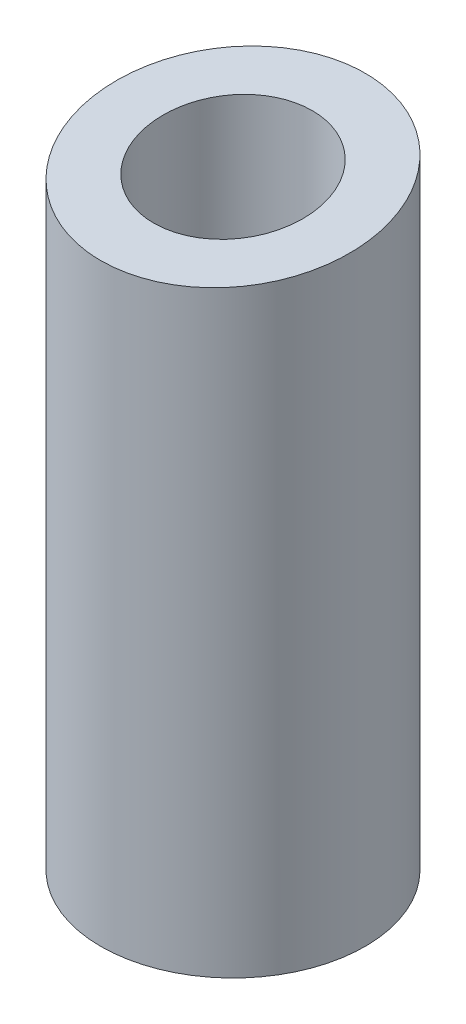
ISO-10303-21;
HEADER;
FILE_DESCRIPTION(('STEP AP214'),'2;1');
FILE_NAME('part.step','',(''),(''),'','','');
FILE_SCHEMA(('AUTOMOTIVE_DESIGN { 1 0 10303 214 1 1 1 1 }'));
ENDSEC;
DATA;
#1=APPLICATION_CONTEXT('core data for automotive mechanical design processes');
#2=APPLICATION_PROTOCOL_DEFINITION('international standard','automotive_design',2000,#1);
#3=PRODUCT_CONTEXT('',#1,'mechanical');
#4=PRODUCT('Part','Part','',(#3));
#5=PRODUCT_RELATED_PRODUCT_CATEGORY('part','',(#4));
#6=PRODUCT_DEFINITION_FORMATION('','',#4);
#7=PRODUCT_DEFINITION_CONTEXT('part definition',#1,'design');
#8=PRODUCT_DEFINITION('design','',#6,#7);
#9=PRODUCT_DEFINITION_SHAPE('','',#8);
#10=(LENGTH_UNIT() NAMED_UNIT(*) SI_UNIT(.MILLI.,.METRE.));
#11=(NAMED_UNIT(*) PLANE_ANGLE_UNIT() SI_UNIT($,.RADIAN.));
#12=(NAMED_UNIT(*) SI_UNIT($,.STERADIAN.) SOLID_ANGLE_UNIT());
#13=UNCERTAINTY_MEASURE_WITH_UNIT(LENGTH_MEASURE(1.E-05),#10,'distance_accuracy_value','');
#14=(GEOMETRIC_REPRESENTATION_CONTEXT(3) GLOBAL_UNCERTAINTY_ASSIGNED_CONTEXT((#13)) GLOBAL_UNIT_ASSIGNED_CONTEXT((#10,
#11,#12)) REPRESENTATION_CONTEXT('',''));
#15=CARTESIAN_POINT('',(0.,0.,0.));
#16=DIRECTION('',(0.,0.,1.));
#17=DIRECTION('',(1.,0.,0.));
#18=AXIS2_PLACEMENT_3D('',#15,#16,#17);
#19=CARTESIAN_POINT('',(0.,13.,0.));
#20=DIRECTION('',(0.,-1.,0.));
#21=DIRECTION('',(0.,0.,-1.));
#22=AXIS2_PLACEMENT_3D('',#19,#20,#21);
#23=CYLINDRICAL_SURFACE('',#22,2.5);
#24=CARTESIAN_POINT('',(0.,0.,0.));
#25=DIRECTION('',(0.,1.,0.));
#26=DIRECTION('',(0.,0.,1.));
#27=AXIS2_PLACEMENT_3D('',#24,#25,#26);
#28=CIRCLE('',#27,2.5);
#29=CARTESIAN_POINT('',(0.,0.,2.5));
#30=VERTEX_POINT('',#29);
#31=EDGE_CURVE('E10',#30,#30,#28,.T.);
#32=ORIENTED_EDGE('',*,*,#31,.T.);
#33=EDGE_LOOP('',(#32));
#34=FACE_BOUND('',#33,.T.);
#35=CARTESIAN_POINT('',(0.,11.5146163350372,0.));
#36=DIRECTION('',(0.,0.99358180621082,0.113115844897364));
#37=DIRECTION('',(0.,-0.113115844897364,0.99358180621082));
#38=AXIS2_PLACEMENT_3D('',#35,#36,#37);
#39=ELLIPSE('',#38,2.51614913273638,2.5);
#40=CARTESIAN_POINT('',(0.,11.23,2.5));
#41=VERTEX_POINT('',#40);
#42=EDGE_CURVE('E56',#41,#41,#39,.T.);
#43=ORIENTED_EDGE('',*,*,#42,.F.);
#44=EDGE_LOOP('',(#43));
#45=FACE_BOUND('',#44,.T.);
#46=ADVANCED_FACE('F43',(#34,#45),#23,.T.);
#47=CARTESIAN_POINT('',(0.,13.,0.));
#48=DIRECTION('',(0.,-1.,0.));
#49=DIRECTION('',(0.,0.,-1.));
#50=AXIS2_PLACEMENT_3D('',#47,#48,#49);
#51=CYLINDRICAL_SURFACE('',#50,1.5);
#52=CARTESIAN_POINT('',(0.,0.,0.));
#53=DIRECTION('',(0.,1.,0.));
#54=DIRECTION('',(0.,0.,1.));
#55=AXIS2_PLACEMENT_3D('',#52,#53,#54);
#56=CIRCLE('',#55,1.5);
#57=CARTESIAN_POINT('',(0.,0.,1.5));
#58=VERTEX_POINT('',#57);
#59=EDGE_CURVE('E51',#58,#58,#56,.T.);
#60=ORIENTED_EDGE('',*,*,#59,.F.);
#61=EDGE_LOOP('',(#60));
#62=FACE_BOUND('',#61,.T.);
#63=CARTESIAN_POINT('',(0.,11.5146163350372,0.));
#64=DIRECTION('',(0.,0.99358180621082,0.113115844897364));
#65=DIRECTION('',(0.,-0.113115844897364,0.99358180621082));
#66=AXIS2_PLACEMENT_3D('',#63,#64,#65);
#67=ELLIPSE('',#66,1.50968947964183,1.5);
#68=CARTESIAN_POINT('',(0.,11.3438465340149,1.5));
#69=VERTEX_POINT('',#68);
#70=EDGE_CURVE('E46',#69,#69,#67,.T.);
#71=ORIENTED_EDGE('',*,*,#70,.T.);
#72=EDGE_LOOP('',(#71));
#73=FACE_BOUND('',#72,.T.);
#74=ADVANCED_FACE('F67',(#62,#73),#51,.F.);
#75=CARTESIAN_POINT('',(0.,0.,0.));
#76=DIRECTION('',(0.,1.,0.));
#77=DIRECTION('',(0.,0.,1.));
#78=AXIS2_PLACEMENT_3D('',#75,#76,#77);
#79=PLANE('',#78);
#80=ORIENTED_EDGE('',*,*,#31,.F.);
#81=EDGE_LOOP('',(#80));
#82=FACE_BOUND('',#81,.T.);
#83=ORIENTED_EDGE('',*,*,#59,.T.);
#84=EDGE_LOOP('',(#83));
#85=FACE_BOUND('',#84,.T.);
#86=ADVANCED_FACE('F71',(#82,#85),#79,.F.);
#87=CARTESIAN_POINT('',(13.,11.7992326700745,-2.5));
#88=DIRECTION('',(0.,0.99358180621082,0.113115844897364));
#89=DIRECTION('',(0.,-0.113115844897364,0.99358180621082));
#90=AXIS2_PLACEMENT_3D('',#87,#88,#89);
#91=PLANE('',#90);
#92=ORIENTED_EDGE('',*,*,#70,.F.);
#93=EDGE_LOOP('',(#92));
#94=FACE_BOUND('',#93,.T.);
#95=ORIENTED_EDGE('',*,*,#42,.T.);
#96=EDGE_LOOP('',(#95));
#97=FACE_BOUND('',#96,.T.);
#98=ADVANCED_FACE('F69',(#94,#97),#91,.T.);
#99=CLOSED_SHELL('',(#46,#74,#86,#98));
#100=MANIFOLD_SOLID_BREP('B2',#99);
#101=ADVANCED_BREP_SHAPE_REPRESENTATION('',(#18,#100),#14);
#102=SHAPE_DEFINITION_REPRESENTATION(#9,#101);
ENDSEC;
END-ISO-10303-21;
